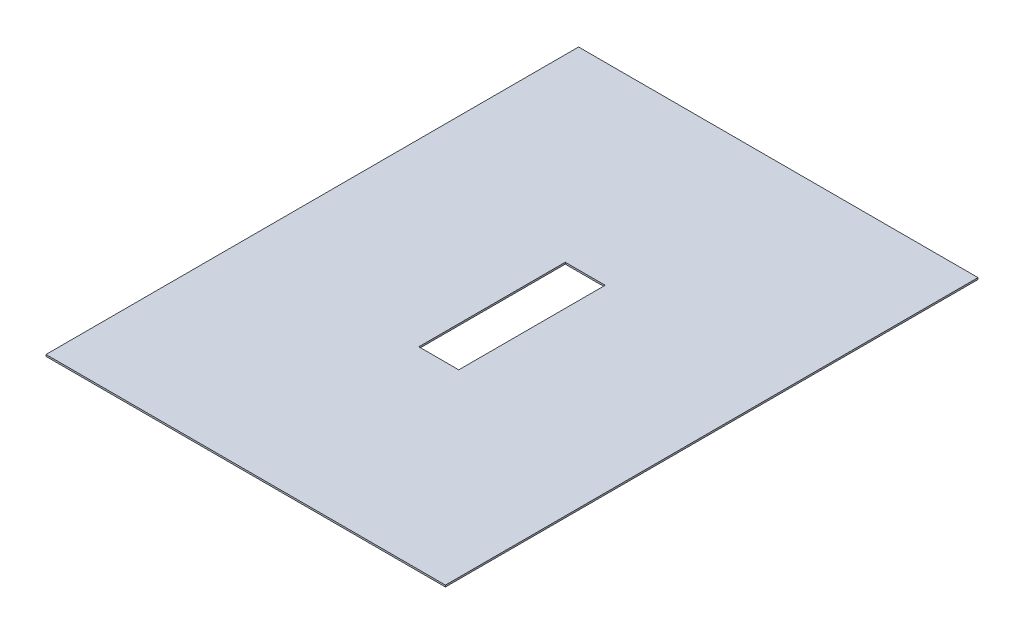
ISO-10303-21;
HEADER;
FILE_DESCRIPTION(('STEP AP214'),'2;1');
FILE_NAME('part.step','',(''),(''),'','','');
FILE_SCHEMA(('AUTOMOTIVE_DESIGN { 1 0 10303 214 1 1 1 1 }'));
ENDSEC;
DATA;
#1=APPLICATION_CONTEXT('core data for automotive mechanical design processes');
#2=APPLICATION_PROTOCOL_DEFINITION('international standard','automotive_design',2000,#1);
#3=PRODUCT_CONTEXT('',#1,'mechanical');
#4=PRODUCT('Part','Part','',(#3));
#5=PRODUCT_RELATED_PRODUCT_CATEGORY('part','',(#4));
#6=PRODUCT_DEFINITION_FORMATION('','',#4);
#7=PRODUCT_DEFINITION_CONTEXT('part definition',#1,'design');
#8=PRODUCT_DEFINITION('design','',#6,#7);
#9=PRODUCT_DEFINITION_SHAPE('','',#8);
#10=(LENGTH_UNIT() NAMED_UNIT(*) SI_UNIT(.MILLI.,.METRE.));
#11=(NAMED_UNIT(*) PLANE_ANGLE_UNIT() SI_UNIT($,.RADIAN.));
#12=(NAMED_UNIT(*) SI_UNIT($,.STERADIAN.) SOLID_ANGLE_UNIT());
#13=UNCERTAINTY_MEASURE_WITH_UNIT(LENGTH_MEASURE(1.E-05),#10,'distance_accuracy_value','');
#14=(GEOMETRIC_REPRESENTATION_CONTEXT(3) GLOBAL_UNCERTAINTY_ASSIGNED_CONTEXT((#13)) GLOBAL_UNIT_ASSIGNED_CONTEXT((#10,
#11,#12)) REPRESENTATION_CONTEXT('',''));
#15=CARTESIAN_POINT('',(0.,0.,0.));
#16=DIRECTION('',(0.,0.,1.));
#17=DIRECTION('',(1.,0.,0.));
#18=AXIS2_PLACEMENT_3D('',#15,#16,#17);
#19=CARTESIAN_POINT('',(0.,0.127,0.));
#20=DIRECTION('',(0.,1.,0.));
#21=DIRECTION('',(0.,0.,1.));
#22=AXIS2_PLACEMENT_3D('',#19,#20,#21);
#23=PLANE('',#22);
#24=DIRECTION('',(0.,0.,1.));
#25=VECTOR('',#24,1.);
#26=CARTESIAN_POINT('',(-15.9767999090814,0.127,-20.3217145022014));
#27=LINE('',#26,#25);
#28=CARTESIAN_POINT('',(-15.9767999090814,0.127,-20.3217145022014));
#29=VERTEX_POINT('',#28);
#30=CARTESIAN_POINT('',(-15.9767999090814,0.127,19.6782854977987));
#31=VERTEX_POINT('',#30);
#32=EDGE_CURVE('E152',#29,#31,#27,.T.);
#33=ORIENTED_EDGE('',*,*,#32,.T.);
#34=DIRECTION('',(1.,0.,0.));
#35=VECTOR('',#34,1.);
#36=CARTESIAN_POINT('',(-15.9767999090814,0.127,19.6782854977987));
#37=LINE('',#36,#35);
#38=CARTESIAN_POINT('',(14.0232000909186,0.127,19.6782854977987));
#39=VERTEX_POINT('',#38);
#40=EDGE_CURVE('E156',#31,#39,#37,.T.);
#41=ORIENTED_EDGE('',*,*,#40,.T.);
#42=DIRECTION('',(0.,0.,-1.));
#43=VECTOR('',#42,1.);
#44=CARTESIAN_POINT('',(14.0232000909186,0.127,-20.3217145022013));
#45=LINE('',#44,#43);
#46=CARTESIAN_POINT('',(14.0232000909186,0.127,-20.3217145022013));
#47=VERTEX_POINT('',#46);
#48=EDGE_CURVE('E160',#39,#47,#45,.T.);
#49=ORIENTED_EDGE('',*,*,#48,.T.);
#50=DIRECTION('',(-1.,0.,0.));
#51=VECTOR('',#50,1.);
#52=CARTESIAN_POINT('',(-15.9767999090814,0.127,-20.3217145022014));
#53=LINE('',#52,#51);
#54=EDGE_CURVE('E163',#47,#29,#53,.T.);
#55=ORIENTED_EDGE('',*,*,#54,.T.);
#56=EDGE_LOOP('',(#33,#41,#49,#55));
#57=FACE_BOUND('',#56,.T.);
#58=DIRECTION('',(1.,0.,0.));
#59=VECTOR('',#58,1.);
#60=CARTESIAN_POINT('',(-2.47679990908137,0.127,5.17828549779865));
#61=LINE('',#60,#59);
#62=CARTESIAN_POINT('',(-2.47679990908137,0.127,5.17828549779865));
#63=VERTEX_POINT('',#62);
#64=CARTESIAN_POINT('',(0.523200090918627,0.127,5.17828549779865));
#65=VERTEX_POINT('',#64);
#66=EDGE_CURVE('E113',#63,#65,#61,.T.);
#67=ORIENTED_EDGE('',*,*,#66,.F.);
#68=DIRECTION('',(0.,0.,1.));
#69=VECTOR('',#68,1.);
#70=CARTESIAN_POINT('',(-2.47679990908137,0.127,-5.82171450220135));
#71=LINE('',#70,#69);
#72=CARTESIAN_POINT('',(-2.47679990908137,0.127,-5.82171450220135));
#73=VERTEX_POINT('',#72);
#74=EDGE_CURVE('E104',#73,#63,#71,.T.);
#75=ORIENTED_EDGE('',*,*,#74,.F.);
#76=DIRECTION('',(-1.,0.,0.));
#77=VECTOR('',#76,1.);
#78=CARTESIAN_POINT('',(-2.47679990908137,0.127,-5.82171450220135));
#79=LINE('',#78,#77);
#80=CARTESIAN_POINT('',(0.523200090918625,0.127,-5.82171450220135));
#81=VERTEX_POINT('',#80);
#82=EDGE_CURVE('E130',#81,#73,#79,.T.);
#83=ORIENTED_EDGE('',*,*,#82,.F.);
#84=DIRECTION('',(0.,0.,-1.));
#85=VECTOR('',#84,1.);
#86=CARTESIAN_POINT('',(0.523200090918625,0.127,-5.82171450220135));
#87=LINE('',#86,#85);
#88=EDGE_CURVE('E126',#65,#81,#87,.T.);
#89=ORIENTED_EDGE('',*,*,#88,.F.);
#90=EDGE_LOOP('',(#67,#75,#83,#89));
#91=FACE_BOUND('',#90,.T.);
#92=ADVANCED_FACE('F38',(#57,#91),#23,.T.);
#93=CARTESIAN_POINT('',(0.,0.,0.));
#94=DIRECTION('',(0.,1.,0.));
#95=DIRECTION('',(0.,0.,1.));
#96=AXIS2_PLACEMENT_3D('',#93,#94,#95);
#97=PLANE('',#96);
#98=DIRECTION('',(0.,0.,1.));
#99=VECTOR('',#98,1.);
#100=CARTESIAN_POINT('',(-15.9767999090814,0.,-20.3217145022014));
#101=LINE('',#100,#99);
#102=CARTESIAN_POINT('',(-15.9767999090814,0.,-20.3217145022014));
#103=VERTEX_POINT('',#102);
#104=CARTESIAN_POINT('',(-15.9767999090814,0.,19.6782854977987));
#105=VERTEX_POINT('',#104);
#106=EDGE_CURVE('E122',#103,#105,#101,.T.);
#107=ORIENTED_EDGE('',*,*,#106,.F.);
#108=DIRECTION('',(-1.,0.,0.));
#109=VECTOR('',#108,1.);
#110=CARTESIAN_POINT('',(-15.9767999090814,0.,-20.3217145022014));
#111=LINE('',#110,#109);
#112=CARTESIAN_POINT('',(14.0232000909186,0.,-20.3217145022013));
#113=VERTEX_POINT('',#112);
#114=EDGE_CURVE('E157',#113,#103,#111,.T.);
#115=ORIENTED_EDGE('',*,*,#114,.F.);
#116=DIRECTION('',(0.,0.,-1.));
#117=VECTOR('',#116,1.);
#118=CARTESIAN_POINT('',(14.0232000909186,0.,-20.3217145022013));
#119=LINE('',#118,#117);
#120=CARTESIAN_POINT('',(14.0232000909186,0.,19.6782854977987));
#121=VERTEX_POINT('',#120);
#122=EDGE_CURVE('E173',#121,#113,#119,.T.);
#123=ORIENTED_EDGE('',*,*,#122,.F.);
#124=DIRECTION('',(1.,0.,0.));
#125=VECTOR('',#124,1.);
#126=CARTESIAN_POINT('',(-15.9767999090814,0.,19.6782854977987));
#127=LINE('',#126,#125);
#128=EDGE_CURVE('E170',#105,#121,#127,.T.);
#129=ORIENTED_EDGE('',*,*,#128,.F.);
#130=EDGE_LOOP('',(#107,#115,#123,#129));
#131=FACE_BOUND('',#130,.T.);
#132=DIRECTION('',(0.,0.,1.));
#133=VECTOR('',#132,1.);
#134=CARTESIAN_POINT('',(-2.47679990908137,0.,-5.82171450220135));
#135=LINE('',#134,#133);
#136=CARTESIAN_POINT('',(-2.47679990908137,0.,-5.82171450220135));
#137=VERTEX_POINT('',#136);
#138=CARTESIAN_POINT('',(-2.47679990908137,0.,5.17828549779865));
#139=VERTEX_POINT('',#138);
#140=EDGE_CURVE('E62',#137,#139,#135,.T.);
#141=ORIENTED_EDGE('',*,*,#140,.T.);
#142=DIRECTION('',(1.,0.,0.));
#143=VECTOR('',#142,1.);
#144=CARTESIAN_POINT('',(-2.47679990908137,0.,5.17828549779865));
#145=LINE('',#144,#143);
#146=CARTESIAN_POINT('',(0.523200090918627,0.,5.17828549779865));
#147=VERTEX_POINT('',#146);
#148=EDGE_CURVE('E120',#139,#147,#145,.T.);
#149=ORIENTED_EDGE('',*,*,#148,.T.);
#150=DIRECTION('',(0.,0.,-1.));
#151=VECTOR('',#150,1.);
#152=CARTESIAN_POINT('',(0.523200090918625,0.,-5.82171450220135));
#153=LINE('',#152,#151);
#154=CARTESIAN_POINT('',(0.523200090918625,0.,-5.82171450220135));
#155=VERTEX_POINT('',#154);
#156=EDGE_CURVE('E139',#147,#155,#153,.T.);
#157=ORIENTED_EDGE('',*,*,#156,.T.);
#158=DIRECTION('',(-1.,0.,0.));
#159=VECTOR('',#158,1.);
#160=CARTESIAN_POINT('',(-2.47679990908137,0.,-5.82171450220135));
#161=LINE('',#160,#159);
#162=EDGE_CURVE('E114',#155,#137,#161,.T.);
#163=ORIENTED_EDGE('',*,*,#162,.T.);
#164=EDGE_LOOP('',(#141,#149,#157,#163));
#165=FACE_BOUND('',#164,.T.);
#166=ADVANCED_FACE('F196',(#131,#165),#97,.F.);
#167=CARTESIAN_POINT('',(-15.9767999090814,0.127,-20.3217145022014));
#168=DIRECTION('',(1.,0.,0.));
#169=DIRECTION('',(0.,0.,-1.));
#170=AXIS2_PLACEMENT_3D('',#167,#168,#169);
#171=PLANE('',#170);
#172=ORIENTED_EDGE('',*,*,#106,.T.);
#173=DIRECTION('',(0.,-1.,0.));
#174=VECTOR('',#173,1.);
#175=CARTESIAN_POINT('',(-15.9767999090814,0.127,19.6782854977987));
#176=LINE('',#175,#174);
#177=EDGE_CURVE('E11',#31,#105,#176,.T.);
#178=ORIENTED_EDGE('',*,*,#177,.F.);
#179=ORIENTED_EDGE('',*,*,#32,.F.);
#180=DIRECTION('',(0.,-1.,0.));
#181=VECTOR('',#180,1.);
#182=CARTESIAN_POINT('',(-15.9767999090814,0.127,-20.3217145022014));
#183=LINE('',#182,#181);
#184=EDGE_CURVE('E166',#29,#103,#183,.T.);
#185=ORIENTED_EDGE('',*,*,#184,.T.);
#186=EDGE_LOOP('',(#172,#178,#179,#185));
#187=FACE_BOUND('',#186,.T.);
#188=ADVANCED_FACE('F40',(#187),#171,.F.);
#189=CARTESIAN_POINT('',(-15.9767999090814,0.127,19.6782854977987));
#190=DIRECTION('',(0.,0.,-1.));
#191=DIRECTION('',(-1.,0.,0.));
#192=AXIS2_PLACEMENT_3D('',#189,#190,#191);
#193=PLANE('',#192);
#194=ORIENTED_EDGE('',*,*,#128,.T.);
#195=DIRECTION('',(0.,-1.,0.));
#196=VECTOR('',#195,1.);
#197=CARTESIAN_POINT('',(14.0232000909186,0.127,19.6782854977987));
#198=LINE('',#197,#196);
#199=EDGE_CURVE('E47',#39,#121,#198,.T.);
#200=ORIENTED_EDGE('',*,*,#199,.F.);
#201=ORIENTED_EDGE('',*,*,#40,.F.);
#202=ORIENTED_EDGE('',*,*,#177,.T.);
#203=EDGE_LOOP('',(#194,#200,#201,#202));
#204=FACE_BOUND('',#203,.T.);
#205=ADVANCED_FACE('F206',(#204),#193,.F.);
#206=CARTESIAN_POINT('',(14.0232000909186,0.127,-20.3217145022013));
#207=DIRECTION('',(-1.,0.,0.));
#208=DIRECTION('',(0.,0.,1.));
#209=AXIS2_PLACEMENT_3D('',#206,#207,#208);
#210=PLANE('',#209);
#211=ORIENTED_EDGE('',*,*,#122,.T.);
#212=DIRECTION('',(0.,-1.,0.));
#213=VECTOR('',#212,1.);
#214=CARTESIAN_POINT('',(14.0232000909186,0.127,-20.3217145022013));
#215=LINE('',#214,#213);
#216=EDGE_CURVE('E181',#47,#113,#215,.T.);
#217=ORIENTED_EDGE('',*,*,#216,.F.);
#218=ORIENTED_EDGE('',*,*,#48,.F.);
#219=ORIENTED_EDGE('',*,*,#199,.T.);
#220=EDGE_LOOP('',(#211,#217,#218,#219));
#221=FACE_BOUND('',#220,.T.);
#222=ADVANCED_FACE('F190',(#221),#210,.F.);
#223=CARTESIAN_POINT('',(-15.9767999090814,0.127,-20.3217145022014));
#224=DIRECTION('',(0.,0.,1.));
#225=DIRECTION('',(1.,0.,0.));
#226=AXIS2_PLACEMENT_3D('',#223,#224,#225);
#227=PLANE('',#226);
#228=ORIENTED_EDGE('',*,*,#114,.T.);
#229=ORIENTED_EDGE('',*,*,#184,.F.);
#230=ORIENTED_EDGE('',*,*,#54,.F.);
#231=ORIENTED_EDGE('',*,*,#216,.T.);
#232=EDGE_LOOP('',(#228,#229,#230,#231));
#233=FACE_BOUND('',#232,.T.);
#234=ADVANCED_FACE('F200',(#233),#227,.F.);
#235=CARTESIAN_POINT('',(-2.47679990908137,0.127,-5.82171450220135));
#236=DIRECTION('',(1.,0.,0.));
#237=DIRECTION('',(0.,0.,-1.));
#238=AXIS2_PLACEMENT_3D('',#235,#236,#237);
#239=PLANE('',#238);
#240=ORIENTED_EDGE('',*,*,#140,.F.);
#241=DIRECTION('',(0.,-1.,0.));
#242=VECTOR('',#241,1.);
#243=CARTESIAN_POINT('',(-2.47679990908137,0.127,-5.82171450220135));
#244=LINE('',#243,#242);
#245=EDGE_CURVE('E108',#73,#137,#244,.T.);
#246=ORIENTED_EDGE('',*,*,#245,.F.);
#247=ORIENTED_EDGE('',*,*,#74,.T.);
#248=DIRECTION('',(0.,-1.,0.));
#249=VECTOR('',#248,1.);
#250=CARTESIAN_POINT('',(-2.47679990908137,0.127,5.17828549779865));
#251=LINE('',#250,#249);
#252=EDGE_CURVE('E107',#63,#139,#251,.T.);
#253=ORIENTED_EDGE('',*,*,#252,.T.);
#254=EDGE_LOOP('',(#240,#246,#247,#253));
#255=FACE_BOUND('',#254,.T.);
#256=ADVANCED_FACE('F106',(#255),#239,.T.);
#257=CARTESIAN_POINT('',(-2.47679990908137,0.127,5.17828549779865));
#258=DIRECTION('',(0.,0.,-1.));
#259=DIRECTION('',(-1.,0.,0.));
#260=AXIS2_PLACEMENT_3D('',#257,#258,#259);
#261=PLANE('',#260);
#262=ORIENTED_EDGE('',*,*,#148,.F.);
#263=ORIENTED_EDGE('',*,*,#252,.F.);
#264=ORIENTED_EDGE('',*,*,#66,.T.);
#265=DIRECTION('',(0.,-1.,0.));
#266=VECTOR('',#265,1.);
#267=CARTESIAN_POINT('',(0.523200090918627,0.127,5.17828549779865));
#268=LINE('',#267,#266);
#269=EDGE_CURVE('E123',#65,#147,#268,.T.);
#270=ORIENTED_EDGE('',*,*,#269,.T.);
#271=EDGE_LOOP('',(#262,#263,#264,#270));
#272=FACE_BOUND('',#271,.T.);
#273=ADVANCED_FACE('F117',(#272),#261,.T.);
#274=CARTESIAN_POINT('',(0.523200090918625,0.127,-5.82171450220135));
#275=DIRECTION('',(-1.,0.,0.));
#276=DIRECTION('',(0.,0.,1.));
#277=AXIS2_PLACEMENT_3D('',#274,#275,#276);
#278=PLANE('',#277);
#279=ORIENTED_EDGE('',*,*,#156,.F.);
#280=ORIENTED_EDGE('',*,*,#269,.F.);
#281=ORIENTED_EDGE('',*,*,#88,.T.);
#282=DIRECTION('',(0.,-1.,0.));
#283=VECTOR('',#282,1.);
#284=CARTESIAN_POINT('',(0.523200090918625,0.127,-5.82171450220135));
#285=LINE('',#284,#283);
#286=EDGE_CURVE('E54',#81,#155,#285,.T.);
#287=ORIENTED_EDGE('',*,*,#286,.T.);
#288=EDGE_LOOP('',(#279,#280,#281,#287));
#289=FACE_BOUND('',#288,.T.);
#290=ADVANCED_FACE('F229',(#289),#278,.T.);
#291=CARTESIAN_POINT('',(-2.47679990908137,0.127,-5.82171450220135));
#292=DIRECTION('',(0.,0.,1.));
#293=DIRECTION('',(1.,0.,0.));
#294=AXIS2_PLACEMENT_3D('',#291,#292,#293);
#295=PLANE('',#294);
#296=ORIENTED_EDGE('',*,*,#162,.F.);
#297=ORIENTED_EDGE('',*,*,#286,.F.);
#298=ORIENTED_EDGE('',*,*,#82,.T.);
#299=ORIENTED_EDGE('',*,*,#245,.T.);
#300=EDGE_LOOP('',(#296,#297,#298,#299));
#301=FACE_BOUND('',#300,.T.);
#302=ADVANCED_FACE('F233',(#301),#295,.T.);
#303=CLOSED_SHELL('',(#92,#166,#188,#205,#222,#234,#256,#273,#290,#302));
#304=MANIFOLD_SOLID_BREP('B2',#303);
#305=ADVANCED_BREP_SHAPE_REPRESENTATION('',(#18,#304),#14);
#306=SHAPE_DEFINITION_REPRESENTATION(#9,#305);
ENDSEC;
END-ISO-10303-21;
